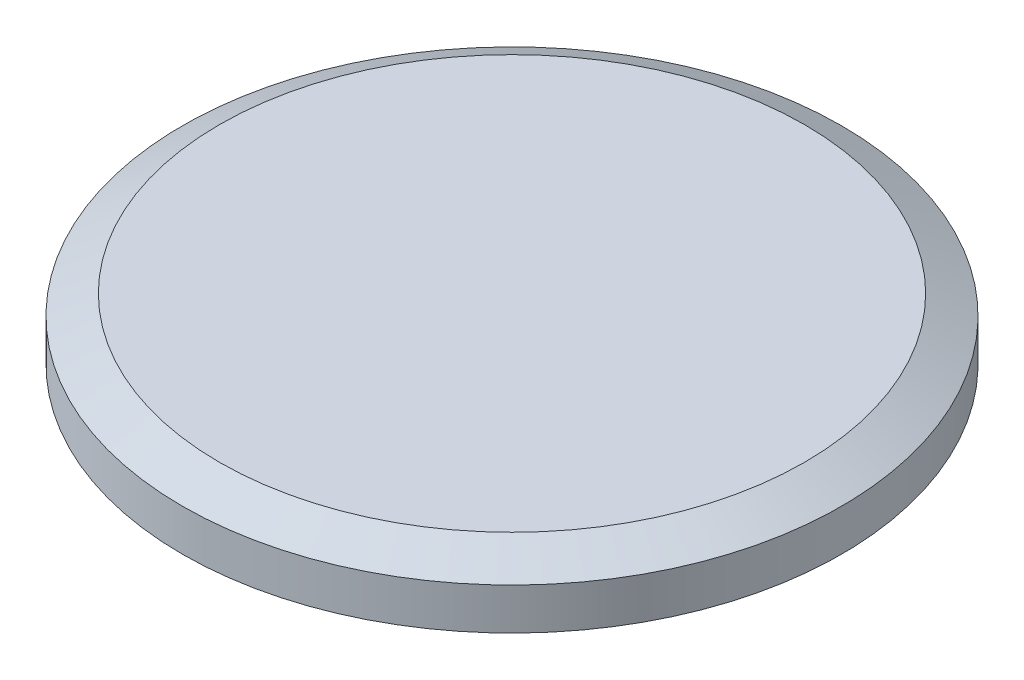
ISO-10303-21;
HEADER;
FILE_DESCRIPTION(('STEP AP214'),'2;1');
FILE_NAME('part.step','',(''),(''),'','','');
FILE_SCHEMA(('AUTOMOTIVE_DESIGN { 1 0 10303 214 1 1 1 1 }'));
ENDSEC;
DATA;
#1=APPLICATION_CONTEXT('core data for automotive mechanical design processes');
#2=APPLICATION_PROTOCOL_DEFINITION('international standard','automotive_design',2000,#1);
#3=PRODUCT_CONTEXT('',#1,'mechanical');
#4=PRODUCT('Part','Part','',(#3));
#5=PRODUCT_RELATED_PRODUCT_CATEGORY('part','',(#4));
#6=PRODUCT_DEFINITION_FORMATION('','',#4);
#7=PRODUCT_DEFINITION_CONTEXT('part definition',#1,'design');
#8=PRODUCT_DEFINITION('design','',#6,#7);
#9=PRODUCT_DEFINITION_SHAPE('','',#8);
#10=(LENGTH_UNIT() NAMED_UNIT(*) SI_UNIT(.MILLI.,.METRE.));
#11=(NAMED_UNIT(*) PLANE_ANGLE_UNIT() SI_UNIT($,.RADIAN.));
#12=(NAMED_UNIT(*) SI_UNIT($,.STERADIAN.) SOLID_ANGLE_UNIT());
#13=UNCERTAINTY_MEASURE_WITH_UNIT(LENGTH_MEASURE(1.E-05),#10,'distance_accuracy_value','');
#14=(GEOMETRIC_REPRESENTATION_CONTEXT(3) GLOBAL_UNCERTAINTY_ASSIGNED_CONTEXT((#13)) GLOBAL_UNIT_ASSIGNED_CONTEXT((#10,
#11,#12)) REPRESENTATION_CONTEXT('',''));
#15=CARTESIAN_POINT('',(0.,0.,0.));
#16=DIRECTION('',(0.,0.,1.));
#17=DIRECTION('',(1.,0.,0.));
#18=AXIS2_PLACEMENT_3D('',#15,#16,#17);
#19=CARTESIAN_POINT('',(0.,12.6474908997093,0.));
#20=DIRECTION('',(0.,1.,0.));
#21=DIRECTION('',(0.,0.,1.));
#22=AXIS2_PLACEMENT_3D('',#19,#20,#21);
#23=PLANE('',#22);
#24=CARTESIAN_POINT('',(0.,12.6474908997093,0.));
#25=DIRECTION('',(0.,-1.,0.));
#26=DIRECTION('',(0.,0.,-1.));
#27=AXIS2_PLACEMENT_3D('',#24,#25,#26);
#28=CIRCLE('',#27,22.5);
#29=CARTESIAN_POINT('',(0.,12.6474908997093,-22.5));
#30=VERTEX_POINT('',#29);
#31=EDGE_CURVE('E10',#30,#30,#28,.T.);
#32=ORIENTED_EDGE('',*,*,#31,.F.);
#33=EDGE_LOOP('',(#32));
#34=FACE_BOUND('',#33,.T.);
#35=ADVANCED_FACE('F29',(#34),#23,.T.);
#36=CARTESIAN_POINT('',(0.,11.1474908997093,0.));
#37=DIRECTION('',(0.,-1.,0.));
#38=DIRECTION('',(0.,0.,-1.));
#39=AXIS2_PLACEMENT_3D('',#36,#37,#38);
#40=CONICAL_SURFACE('',#39,25.35,1.08631839775787);
#41=ORIENTED_EDGE('',*,*,#31,.T.);
#42=EDGE_LOOP('',(#41));
#43=FACE_BOUND('',#42,.T.);
#44=CARTESIAN_POINT('',(0.,11.1474908997093,0.));
#45=DIRECTION('',(0.,-1.,0.));
#46=DIRECTION('',(0.,0.,-1.));
#47=AXIS2_PLACEMENT_3D('',#44,#45,#46);
#48=CIRCLE('',#47,25.35);
#49=CARTESIAN_POINT('',(0.,11.1474908997093,-25.35));
#50=VERTEX_POINT('',#49);
#51=EDGE_CURVE('E35',#50,#50,#48,.T.);
#52=ORIENTED_EDGE('',*,*,#51,.F.);
#53=EDGE_LOOP('',(#52));
#54=FACE_BOUND('',#53,.T.);
#55=ADVANCED_FACE('F61',(#43,#54),#40,.T.);
#56=CARTESIAN_POINT('',(0.,6.44749089970934,0.));
#57=DIRECTION('',(0.,-1.,0.));
#58=DIRECTION('',(0.,0.,-1.));
#59=AXIS2_PLACEMENT_3D('',#56,#57,#58);
#60=CYLINDRICAL_SURFACE('',#59,25.35);
#61=ORIENTED_EDGE('',*,*,#51,.T.);
#62=EDGE_LOOP('',(#61));
#63=FACE_BOUND('',#62,.T.);
#64=CARTESIAN_POINT('',(0.,7.94749089970934,0.));
#65=DIRECTION('',(0.,-1.,0.));
#66=DIRECTION('',(0.,0.,-1.));
#67=AXIS2_PLACEMENT_3D('',#64,#65,#66);
#68=CIRCLE('',#67,25.35);
#69=CARTESIAN_POINT('',(0.,7.94749089970934,-25.35));
#70=VERTEX_POINT('',#69);
#71=EDGE_CURVE('E39',#70,#70,#68,.T.);
#72=ORIENTED_EDGE('',*,*,#71,.F.);
#73=EDGE_LOOP('',(#72));
#74=FACE_BOUND('',#73,.T.);
#75=ADVANCED_FACE('F53',(#63,#74),#60,.T.);
#76=CARTESIAN_POINT('',(0.,6.44749089970934,0.));
#77=DIRECTION('',(0.,1.,0.));
#78=DIRECTION('',(0.,0.,1.));
#79=AXIS2_PLACEMENT_3D('',#76,#77,#78);
#80=CONICAL_SURFACE('',#79,22.5,1.08631839775787);
#81=ORIENTED_EDGE('',*,*,#71,.T.);
#82=EDGE_LOOP('',(#81));
#83=FACE_BOUND('',#82,.T.);
#84=CARTESIAN_POINT('',(0.,6.44749089970934,0.));
#85=DIRECTION('',(0.,-1.,0.));
#86=DIRECTION('',(0.,0.,-1.));
#87=AXIS2_PLACEMENT_3D('',#84,#85,#86);
#88=CIRCLE('',#87,22.5);
#89=CARTESIAN_POINT('',(0.,6.44749089970934,-22.5));
#90=VERTEX_POINT('',#89);
#91=EDGE_CURVE('E43',#90,#90,#88,.T.);
#92=ORIENTED_EDGE('',*,*,#91,.F.);
#93=EDGE_LOOP('',(#92));
#94=FACE_BOUND('',#93,.T.);
#95=ADVANCED_FACE('F51',(#83,#94),#80,.T.);
#96=CARTESIAN_POINT('',(22.5,6.44749089970934,0.));
#97=DIRECTION('',(0.,-1.,0.));
#98=DIRECTION('',(0.,0.,-1.));
#99=AXIS2_PLACEMENT_3D('',#96,#97,#98);
#100=PLANE('',#99);
#101=ORIENTED_EDGE('',*,*,#91,.T.);
#102=EDGE_LOOP('',(#101));
#103=FACE_BOUND('',#102,.T.);
#104=ADVANCED_FACE('F49',(#103),#100,.T.);
#105=CLOSED_SHELL('',(#35,#55,#75,#95,#104));
#106=MANIFOLD_SOLID_BREP('B2',#105);
#107=ADVANCED_BREP_SHAPE_REPRESENTATION('',(#18,#106),#14);
#108=SHAPE_DEFINITION_REPRESENTATION(#9,#107);
ENDSEC;
END-ISO-10303-21;
